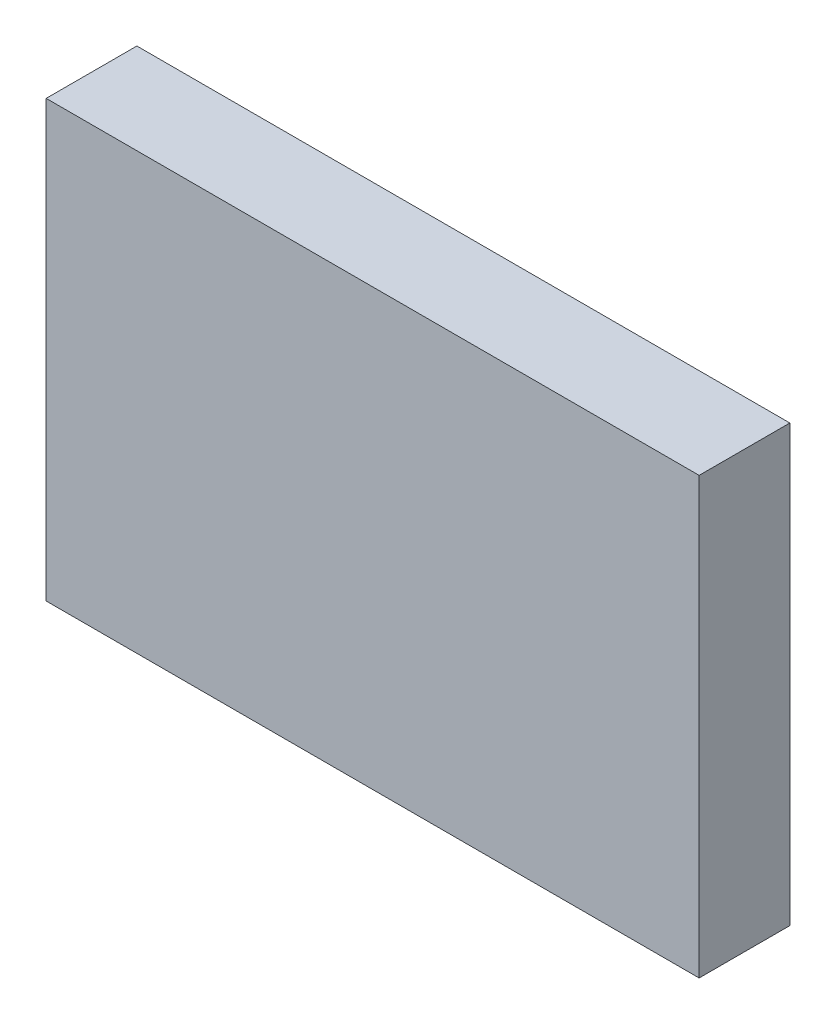
ISO-10303-21;
HEADER;
FILE_DESCRIPTION(('STEP AP214'),'2;1');
FILE_NAME('part.step','',(''),(''),'','','');
FILE_SCHEMA(('AUTOMOTIVE_DESIGN { 1 0 10303 214 1 1 1 1 }'));
ENDSEC;
DATA;
#1=APPLICATION_CONTEXT('core data for automotive mechanical design processes');
#2=APPLICATION_PROTOCOL_DEFINITION('international standard','automotive_design',2000,#1);
#3=PRODUCT_CONTEXT('',#1,'mechanical');
#4=PRODUCT('Part','Part','',(#3));
#5=PRODUCT_RELATED_PRODUCT_CATEGORY('part','',(#4));
#6=PRODUCT_DEFINITION_FORMATION('','',#4);
#7=PRODUCT_DEFINITION_CONTEXT('part definition',#1,'design');
#8=PRODUCT_DEFINITION('design','',#6,#7);
#9=PRODUCT_DEFINITION_SHAPE('','',#8);
#10=(LENGTH_UNIT() NAMED_UNIT(*) SI_UNIT(.MILLI.,.METRE.));
#11=(NAMED_UNIT(*) PLANE_ANGLE_UNIT() SI_UNIT($,.RADIAN.));
#12=(NAMED_UNIT(*) SI_UNIT($,.STERADIAN.) SOLID_ANGLE_UNIT());
#13=UNCERTAINTY_MEASURE_WITH_UNIT(LENGTH_MEASURE(1.E-05),#10,'distance_accuracy_value','');
#14=(GEOMETRIC_REPRESENTATION_CONTEXT(3) GLOBAL_UNCERTAINTY_ASSIGNED_CONTEXT((#13)) GLOBAL_UNIT_ASSIGNED_CONTEXT((#10,
#11,#12)) REPRESENTATION_CONTEXT('',''));
#15=CARTESIAN_POINT('',(0.,0.,0.));
#16=DIRECTION('',(0.,0.,1.));
#17=DIRECTION('',(1.,0.,0.));
#18=AXIS2_PLACEMENT_3D('',#15,#16,#17);
#19=CARTESIAN_POINT('',(90.,-60.,25.));
#20=DIRECTION('',(-1.,0.,0.));
#21=DIRECTION('',(0.,0.,1.));
#22=AXIS2_PLACEMENT_3D('',#19,#20,#21);
#23=PLANE('',#22);
#24=DIRECTION('',(0.,1.,0.));
#25=VECTOR('',#24,1.);
#26=CARTESIAN_POINT('',(90.,-60.,0.));
#27=LINE('',#26,#25);
#28=CARTESIAN_POINT('',(90.,-60.,0.));
#29=VERTEX_POINT('',#28);
#30=CARTESIAN_POINT('',(90.,60.,0.));
#31=VERTEX_POINT('',#30);
#32=EDGE_CURVE('E96',#29,#31,#27,.T.);
#33=ORIENTED_EDGE('',*,*,#32,.T.);
#34=DIRECTION('',(0.,0.,-1.));
#35=VECTOR('',#34,1.);
#36=CARTESIAN_POINT('',(90.,60.,25.));
#37=LINE('',#36,#35);
#38=CARTESIAN_POINT('',(90.,60.,25.));
#39=VERTEX_POINT('',#38);
#40=EDGE_CURVE('E11',#39,#31,#37,.T.);
#41=ORIENTED_EDGE('',*,*,#40,.F.);
#42=DIRECTION('',(0.,1.,0.));
#43=VECTOR('',#42,1.);
#44=CARTESIAN_POINT('',(90.,-60.,25.));
#45=LINE('',#44,#43);
#46=CARTESIAN_POINT('',(90.,-60.,25.));
#47=VERTEX_POINT('',#46);
#48=EDGE_CURVE('E84',#47,#39,#45,.T.);
#49=ORIENTED_EDGE('',*,*,#48,.F.);
#50=DIRECTION('',(0.,0.,-1.));
#51=VECTOR('',#50,1.);
#52=CARTESIAN_POINT('',(90.,-60.,25.));
#53=LINE('',#52,#51);
#54=EDGE_CURVE('E92',#47,#29,#53,.T.);
#55=ORIENTED_EDGE('',*,*,#54,.T.);
#56=EDGE_LOOP('',(#33,#41,#49,#55));
#57=FACE_BOUND('',#56,.T.);
#58=ADVANCED_FACE('F33',(#57),#23,.F.);
#59=CARTESIAN_POINT('',(-90.,60.,25.));
#60=DIRECTION('',(0.,-1.,0.));
#61=DIRECTION('',(0.,0.,-1.));
#62=AXIS2_PLACEMENT_3D('',#59,#60,#61);
#63=PLANE('',#62);
#64=DIRECTION('',(-1.,0.,0.));
#65=VECTOR('',#64,1.);
#66=CARTESIAN_POINT('',(-90.,60.,0.));
#67=LINE('',#66,#65);
#68=CARTESIAN_POINT('',(-90.,60.,0.));
#69=VERTEX_POINT('',#68);
#70=EDGE_CURVE('E88',#31,#69,#67,.T.);
#71=ORIENTED_EDGE('',*,*,#70,.T.);
#72=DIRECTION('',(0.,0.,-1.));
#73=VECTOR('',#72,1.);
#74=CARTESIAN_POINT('',(-90.,60.,25.));
#75=LINE('',#74,#73);
#76=CARTESIAN_POINT('',(-90.,60.,25.));
#77=VERTEX_POINT('',#76);
#78=EDGE_CURVE('E41',#77,#69,#75,.T.);
#79=ORIENTED_EDGE('',*,*,#78,.F.);
#80=DIRECTION('',(-1.,0.,0.));
#81=VECTOR('',#80,1.);
#82=CARTESIAN_POINT('',(-90.,60.,25.));
#83=LINE('',#82,#81);
#84=EDGE_CURVE('E79',#39,#77,#83,.T.);
#85=ORIENTED_EDGE('',*,*,#84,.F.);
#86=ORIENTED_EDGE('',*,*,#40,.T.);
#87=EDGE_LOOP('',(#71,#79,#85,#86));
#88=FACE_BOUND('',#87,.T.);
#89=ADVANCED_FACE('F87',(#88),#63,.F.);
#90=CARTESIAN_POINT('',(-90.,-60.,25.));
#91=DIRECTION('',(1.,0.,0.));
#92=DIRECTION('',(0.,0.,-1.));
#93=AXIS2_PLACEMENT_3D('',#90,#91,#92);
#94=PLANE('',#93);
#95=DIRECTION('',(0.,-1.,0.));
#96=VECTOR('',#95,1.);
#97=CARTESIAN_POINT('',(-90.,-60.,0.));
#98=LINE('',#97,#96);
#99=CARTESIAN_POINT('',(-90.,-60.,0.));
#100=VERTEX_POINT('',#99);
#101=EDGE_CURVE('E66',#69,#100,#98,.T.);
#102=ORIENTED_EDGE('',*,*,#101,.T.);
#103=DIRECTION('',(0.,0.,-1.));
#104=VECTOR('',#103,1.);
#105=CARTESIAN_POINT('',(-90.,-60.,25.));
#106=LINE('',#105,#104);
#107=CARTESIAN_POINT('',(-90.,-60.,25.));
#108=VERTEX_POINT('',#107);
#109=EDGE_CURVE('E89',#108,#100,#106,.T.);
#110=ORIENTED_EDGE('',*,*,#109,.F.);
#111=DIRECTION('',(0.,-1.,0.));
#112=VECTOR('',#111,1.);
#113=CARTESIAN_POINT('',(-90.,-60.,25.));
#114=LINE('',#113,#112);
#115=EDGE_CURVE('E82',#77,#108,#114,.T.);
#116=ORIENTED_EDGE('',*,*,#115,.F.);
#117=ORIENTED_EDGE('',*,*,#78,.T.);
#118=EDGE_LOOP('',(#102,#110,#116,#117));
#119=FACE_BOUND('',#118,.T.);
#120=ADVANCED_FACE('F90',(#119),#94,.F.);
#121=CARTESIAN_POINT('',(-90.,-60.,25.));
#122=DIRECTION('',(0.,1.,0.));
#123=DIRECTION('',(0.,0.,1.));
#124=AXIS2_PLACEMENT_3D('',#121,#122,#123);
#125=PLANE('',#124);
#126=DIRECTION('',(1.,0.,0.));
#127=VECTOR('',#126,1.);
#128=CARTESIAN_POINT('',(-90.,-60.,0.));
#129=LINE('',#128,#127);
#130=EDGE_CURVE('E72',#100,#29,#129,.T.);
#131=ORIENTED_EDGE('',*,*,#130,.T.);
#132=ORIENTED_EDGE('',*,*,#54,.F.);
#133=DIRECTION('',(1.,0.,0.));
#134=VECTOR('',#133,1.);
#135=CARTESIAN_POINT('',(-90.,-60.,25.));
#136=LINE('',#135,#134);
#137=EDGE_CURVE('E49',#108,#47,#136,.T.);
#138=ORIENTED_EDGE('',*,*,#137,.F.);
#139=ORIENTED_EDGE('',*,*,#109,.T.);
#140=EDGE_LOOP('',(#131,#132,#138,#139));
#141=FACE_BOUND('',#140,.T.);
#142=ADVANCED_FACE('F103',(#141),#125,.F.);
#143=CARTESIAN_POINT('',(0.,0.,25.));
#144=DIRECTION('',(0.,0.,-1.));
#145=DIRECTION('',(-1.,0.,0.));
#146=AXIS2_PLACEMENT_3D('',#143,#144,#145);
#147=PLANE('',#146);
#148=ORIENTED_EDGE('',*,*,#48,.T.);
#149=ORIENTED_EDGE('',*,*,#84,.T.);
#150=ORIENTED_EDGE('',*,*,#115,.T.);
#151=ORIENTED_EDGE('',*,*,#137,.T.);
#152=EDGE_LOOP('',(#148,#149,#150,#151));
#153=FACE_BOUND('',#152,.T.);
#154=ADVANCED_FACE('F80',(#153),#147,.F.);
#155=CARTESIAN_POINT('',(0.,0.,0.));
#156=DIRECTION('',(0.,0.,-1.));
#157=DIRECTION('',(-1.,0.,0.));
#158=AXIS2_PLACEMENT_3D('',#155,#156,#157);
#159=PLANE('',#158);
#160=ORIENTED_EDGE('',*,*,#32,.F.);
#161=ORIENTED_EDGE('',*,*,#130,.F.);
#162=ORIENTED_EDGE('',*,*,#101,.F.);
#163=ORIENTED_EDGE('',*,*,#70,.F.);
#164=EDGE_LOOP('',(#160,#161,#162,#163));
#165=FACE_BOUND('',#164,.T.);
#166=ADVANCED_FACE('F106',(#165),#159,.T.);
#167=CLOSED_SHELL('',(#58,#89,#120,#142,#154,#166));
#168=MANIFOLD_SOLID_BREP('B2',#167);
#169=ADVANCED_BREP_SHAPE_REPRESENTATION('',(#18,#168),#14);
#170=SHAPE_DEFINITION_REPRESENTATION(#9,#169);
ENDSEC;
END-ISO-10303-21;
